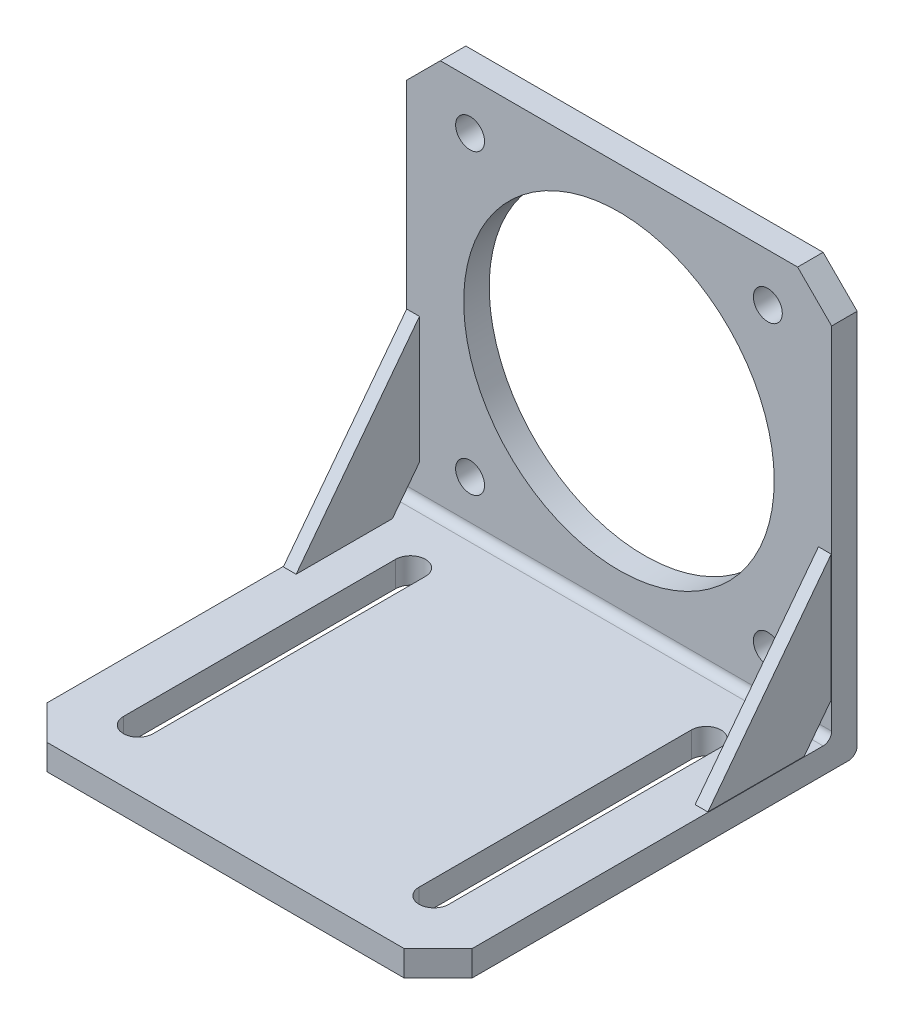
ISO-10303-21;
HEADER;
FILE_DESCRIPTION(('STEP AP214'),'2;1');
FILE_NAME('part.step','',(''),(''),'','','');
FILE_SCHEMA(('AUTOMOTIVE_DESIGN { 1 0 10303 214 1 1 1 1 }'));
ENDSEC;
DATA;
#1=APPLICATION_CONTEXT('core data for automotive mechanical design processes');
#2=APPLICATION_PROTOCOL_DEFINITION('international standard','automotive_design',2000,#1);
#3=PRODUCT_CONTEXT('',#1,'mechanical');
#4=PRODUCT('Part','Part','',(#3));
#5=PRODUCT_RELATED_PRODUCT_CATEGORY('part','',(#4));
#6=PRODUCT_DEFINITION_FORMATION('','',#4);
#7=PRODUCT_DEFINITION_CONTEXT('part definition',#1,'design');
#8=PRODUCT_DEFINITION('design','',#6,#7);
#9=PRODUCT_DEFINITION_SHAPE('','',#8);
#10=(LENGTH_UNIT() NAMED_UNIT(*) SI_UNIT(.MILLI.,.METRE.));
#11=(NAMED_UNIT(*) PLANE_ANGLE_UNIT() SI_UNIT($,.RADIAN.));
#12=(NAMED_UNIT(*) SI_UNIT($,.STERADIAN.) SOLID_ANGLE_UNIT());
#13=UNCERTAINTY_MEASURE_WITH_UNIT(LENGTH_MEASURE(1.E-05),#10,'distance_accuracy_value','');
#14=(GEOMETRIC_REPRESENTATION_CONTEXT(3) GLOBAL_UNCERTAINTY_ASSIGNED_CONTEXT((#13)) GLOBAL_UNIT_ASSIGNED_CONTEXT((#10,
#11,#12)) REPRESENTATION_CONTEXT('',''));
#15=CARTESIAN_POINT('',(0.,0.,0.));
#16=DIRECTION('',(0.,0.,1.));
#17=DIRECTION('',(1.,0.,0.));
#18=AXIS2_PLACEMENT_3D('',#15,#16,#17);
#19=CARTESIAN_POINT('',(0.,0.,6.));
#20=DIRECTION('',(0.,0.,-1.));
#21=DIRECTION('',(-1.,0.,0.));
#22=AXIS2_PLACEMENT_3D('',#19,#20,#21);
#23=PLANE('',#22);
#24=DIRECTION('',(0.,-1.,0.));
#25=VECTOR('',#24,1.);
#26=CARTESIAN_POINT('',(-46.9,8.28794911564137,6.));
#27=LINE('',#26,#25);
#28=CARTESIAN_POINT('',(-46.9,37.9579534258356,6.));
#29=VERTEX_POINT('',#28);
#30=CARTESIAN_POINT('',(-46.9,8.28794911564137,6.));
#31=VERTEX_POINT('',#30);
#32=EDGE_CURVE('E249',#29,#31,#27,.T.);
#33=ORIENTED_EDGE('',*,*,#32,.T.);
#34=DIRECTION('',(-1.,0.,0.));
#35=VECTOR('',#34,1.);
#36=CARTESIAN_POINT('',(-46.9,8.28794911564137,6.));
#37=LINE('',#36,#35);
#38=CARTESIAN_POINT('',(-49.9,8.28794911564137,6.));
#39=VERTEX_POINT('',#38);
#40=EDGE_CURVE('E262',#31,#39,#37,.T.);
#41=ORIENTED_EDGE('',*,*,#40,.T.);
#42=DIRECTION('',(0.,-1.,0.));
#43=VECTOR('',#42,1.);
#44=CARTESIAN_POINT('',(-49.9,8.28794911564137,6.));
#45=LINE('',#44,#43);
#46=CARTESIAN_POINT('',(-49.9,37.9579534258356,6.));
#47=VERTEX_POINT('',#46);
#48=EDGE_CURVE('E263',#47,#39,#45,.T.);
#49=ORIENTED_EDGE('',*,*,#48,.F.);
#50=DIRECTION('',(-1.,0.,0.));
#51=VECTOR('',#50,1.);
#52=CARTESIAN_POINT('',(-46.9,37.9579534258356,6.));
#53=LINE('',#52,#51);
#54=EDGE_CURVE('E271',#29,#47,#53,.T.);
#55=ORIENTED_EDGE('',*,*,#54,.F.);
#56=EDGE_LOOP('',(#33,#41,#49,#55));
#57=FACE_BOUND('',#56,.T.);
#58=CARTESIAN_POINT('',(-34.999999999998,11.2079534258356,6.));
#59=DIRECTION('',(0.,0.,1.));
#60=DIRECTION('',(1.,0.,0.));
#61=AXIS2_PLACEMENT_3D('',#58,#59,#60);
#62=CIRCLE('',#61,3.4);
#63=CARTESIAN_POINT('',(-31.599999999998,11.2079534258356,6.));
#64=VERTEX_POINT('',#63);
#65=EDGE_CURVE('E358',#64,#64,#62,.T.);
#66=ORIENTED_EDGE('',*,*,#65,.F.);
#67=EDGE_LOOP('',(#66));
#68=FACE_BOUND('',#67,.T.);
#69=CARTESIAN_POINT('',(35.0000000000019,11.2079534258376,6.));
#70=DIRECTION('',(0.,0.,1.));
#71=DIRECTION('',(1.,0.,0.));
#72=AXIS2_PLACEMENT_3D('',#69,#70,#71);
#73=CIRCLE('',#72,3.4);
#74=CARTESIAN_POINT('',(38.4000000000019,11.2079534258376,6.));
#75=VERTEX_POINT('',#74);
#76=EDGE_CURVE('E364',#75,#75,#73,.T.);
#77=ORIENTED_EDGE('',*,*,#76,.F.);
#78=EDGE_LOOP('',(#77));
#79=FACE_BOUND('',#78,.T.);
#80=CARTESIAN_POINT('',(35.,81.2079534258376,6.));
#81=DIRECTION('',(0.,0.,1.));
#82=DIRECTION('',(1.,0.,0.));
#83=AXIS2_PLACEMENT_3D('',#80,#81,#82);
#84=CIRCLE('',#83,3.4);
#85=CARTESIAN_POINT('',(38.4,81.2079534258376,6.));
#86=VERTEX_POINT('',#85);
#87=EDGE_CURVE('E370',#86,#86,#84,.T.);
#88=ORIENTED_EDGE('',*,*,#87,.F.);
#89=EDGE_LOOP('',(#88));
#90=FACE_BOUND('',#89,.T.);
#91=CARTESIAN_POINT('',(-35.,81.2079534258356,6.));
#92=DIRECTION('',(0.,0.,1.));
#93=DIRECTION('',(1.,0.,0.));
#94=AXIS2_PLACEMENT_3D('',#91,#92,#93);
#95=CIRCLE('',#94,3.4);
#96=CARTESIAN_POINT('',(-31.6,81.2079534258356,6.));
#97=VERTEX_POINT('',#96);
#98=EDGE_CURVE('E376',#97,#97,#95,.T.);
#99=ORIENTED_EDGE('',*,*,#98,.F.);
#100=EDGE_LOOP('',(#99));
#101=FACE_BOUND('',#100,.T.);
#102=CARTESIAN_POINT('',(0.,46.2079534258356,6.));
#103=DIRECTION('',(0.,0.,1.));
#104=DIRECTION('',(1.,0.,0.));
#105=AXIS2_PLACEMENT_3D('',#102,#103,#104);
#106=CIRCLE('',#105,36.5);
#107=CARTESIAN_POINT('',(36.5,46.2079534258356,6.));
#108=VERTEX_POINT('',#107);
#109=EDGE_CURVE('E382',#108,#108,#106,.T.);
#110=ORIENTED_EDGE('',*,*,#109,.F.);
#111=EDGE_LOOP('',(#110));
#112=FACE_BOUND('',#111,.T.);
#113=DIRECTION('',(0.,-1.,0.));
#114=VECTOR('',#113,1.);
#115=CARTESIAN_POINT('',(-50.,-6.04204657416441,6.));
#116=LINE('',#115,#114);
#117=CARTESIAN_POINT('',(-50.,84.4579534258356,6.));
#118=VERTEX_POINT('',#117);
#119=CARTESIAN_POINT('',(-50.,1.95795342583559,6.));
#120=VERTEX_POINT('',#119);
#121=EDGE_CURVE('E388',#118,#120,#116,.T.);
#122=ORIENTED_EDGE('',*,*,#121,.T.);
#123=DIRECTION('',(-1.,0.,0.));
#124=VECTOR('',#123,1.);
#125=CARTESIAN_POINT('',(50.,1.95795342583559,6.));
#126=LINE('',#125,#124);
#127=CARTESIAN_POINT('',(50.,1.95795342583559,6.));
#128=VERTEX_POINT('',#127);
#129=EDGE_CURVE('E457',#120,#128,#126,.F.);
#130=ORIENTED_EDGE('',*,*,#129,.T.);
#131=DIRECTION('',(0.,1.,0.));
#132=VECTOR('',#131,1.);
#133=CARTESIAN_POINT('',(50.,-6.04204657416441,6.));
#134=LINE('',#133,#132);
#135=CARTESIAN_POINT('',(50.,84.4579534258356,6.));
#136=VERTEX_POINT('',#135);
#137=EDGE_CURVE('E390',#128,#136,#134,.T.);
#138=ORIENTED_EDGE('',*,*,#137,.T.);
#139=DIRECTION('',(0.707106781186547,-0.707106781186548,0.));
#140=VECTOR('',#139,1.);
#141=CARTESIAN_POINT('',(42.,92.4579534258356,6.));
#142=LINE('',#141,#140);
#143=CARTESIAN_POINT('',(42.,92.4579534258356,6.));
#144=VERTEX_POINT('',#143);
#145=EDGE_CURVE('E425',#136,#144,#142,.F.);
#146=ORIENTED_EDGE('',*,*,#145,.T.);
#147=DIRECTION('',(-1.,0.,0.));
#148=VECTOR('',#147,1.);
#149=CARTESIAN_POINT('',(-50.,92.4579534258356,6.));
#150=LINE('',#149,#148);
#151=CARTESIAN_POINT('',(-41.9999999999999,92.4579534258356,6.));
#152=VERTEX_POINT('',#151);
#153=EDGE_CURVE('E393',#144,#152,#150,.T.);
#154=ORIENTED_EDGE('',*,*,#153,.T.);
#155=DIRECTION('',(0.707106781186549,0.707106781186546,0.));
#156=VECTOR('',#155,1.);
#157=CARTESIAN_POINT('',(-50.,84.4579534258356,6.));
#158=LINE('',#157,#156);
#159=EDGE_CURVE('E423',#152,#118,#158,.F.);
#160=ORIENTED_EDGE('',*,*,#159,.T.);
#161=EDGE_LOOP('',(#122,#130,#138,#146,#154,#160));
#162=FACE_BOUND('',#161,.T.);
#163=DIRECTION('',(0.,1.,0.));
#164=VECTOR('',#163,1.);
#165=CARTESIAN_POINT('',(46.9,8.2879491156414,6.));
#166=LINE('',#165,#164);
#167=CARTESIAN_POINT('',(46.9,8.2879491156414,6.));
#168=VERTEX_POINT('',#167);
#169=CARTESIAN_POINT('',(46.9,37.9579534258356,6.));
#170=VERTEX_POINT('',#169);
#171=EDGE_CURVE('E242',#168,#170,#166,.T.);
#172=ORIENTED_EDGE('',*,*,#171,.T.);
#173=DIRECTION('',(1.,0.,0.));
#174=VECTOR('',#173,1.);
#175=CARTESIAN_POINT('',(46.9,37.9579534258356,6.));
#176=LINE('',#175,#174);
#177=CARTESIAN_POINT('',(49.9,37.9579534258356,6.));
#178=VERTEX_POINT('',#177);
#179=EDGE_CURVE('E235',#170,#178,#176,.T.);
#180=ORIENTED_EDGE('',*,*,#179,.T.);
#181=DIRECTION('',(0.,1.,0.));
#182=VECTOR('',#181,1.);
#183=CARTESIAN_POINT('',(49.9,8.2879491156414,6.));
#184=LINE('',#183,#182);
#185=CARTESIAN_POINT('',(49.9,8.2879491156414,6.));
#186=VERTEX_POINT('',#185);
#187=EDGE_CURVE('E236',#186,#178,#184,.T.);
#188=ORIENTED_EDGE('',*,*,#187,.F.);
#189=DIRECTION('',(1.,0.,0.));
#190=VECTOR('',#189,1.);
#191=CARTESIAN_POINT('',(46.9,8.2879491156414,6.));
#192=LINE('',#191,#190);
#193=EDGE_CURVE('E244',#168,#186,#192,.T.);
#194=ORIENTED_EDGE('',*,*,#193,.F.);
#195=EDGE_LOOP('',(#172,#180,#188,#194));
#196=FACE_BOUND('',#195,.T.);
#197=ADVANCED_FACE('F33',(#57,#68,#79,#90,#101,#112,#162,#196),#23,.F.);
#198=CARTESIAN_POINT('',(-50.,-0.0420465741644057,98.5));
#199=DIRECTION('',(0.,-1.,0.));
#200=DIRECTION('',(0.,0.,-1.));
#201=AXIS2_PLACEMENT_3D('',#198,#199,#200);
#202=PLANE('',#201);
#203=DIRECTION('',(0.,0.,1.));
#204=VECTOR('',#203,1.);
#205=CARTESIAN_POINT('',(-46.9,-0.0420465741644057,35.));
#206=LINE('',#205,#204);
#207=CARTESIAN_POINT('',(-46.9,-0.0420465741644085,12.3571019737992));
#208=VERTEX_POINT('',#207);
#209=CARTESIAN_POINT('',(-46.9,-0.0420465741644057,35.));
#210=VERTEX_POINT('',#209);
#211=EDGE_CURVE('E256',#208,#210,#206,.T.);
#212=ORIENTED_EDGE('',*,*,#211,.T.);
#213=DIRECTION('',(-1.,0.,0.));
#214=VECTOR('',#213,1.);
#215=CARTESIAN_POINT('',(-46.9,-0.0420465741644057,35.));
#216=LINE('',#215,#214);
#217=CARTESIAN_POINT('',(-49.9,-0.0420465741644057,35.));
#218=VERTEX_POINT('',#217);
#219=EDGE_CURVE('E275',#210,#218,#216,.T.);
#220=ORIENTED_EDGE('',*,*,#219,.T.);
#221=DIRECTION('',(0.,0.,1.));
#222=VECTOR('',#221,1.);
#223=CARTESIAN_POINT('',(-49.9,-0.0420465741644057,35.));
#224=LINE('',#223,#222);
#225=CARTESIAN_POINT('',(-49.9,-0.0420465741644031,12.3571019737991));
#226=VERTEX_POINT('',#225);
#227=EDGE_CURVE('E268',#226,#218,#224,.T.);
#228=ORIENTED_EDGE('',*,*,#227,.F.);
#229=DIRECTION('',(-1.,0.,0.));
#230=VECTOR('',#229,1.);
#231=CARTESIAN_POINT('',(-46.9,-0.0420465741644085,12.3571019737992));
#232=LINE('',#231,#230);
#233=EDGE_CURVE('E278',#208,#226,#232,.T.);
#234=ORIENTED_EDGE('',*,*,#233,.F.);
#235=EDGE_LOOP('',(#212,#220,#228,#234));
#236=FACE_BOUND('',#235,.T.);
#237=DIRECTION('',(0.,0.,-1.));
#238=VECTOR('',#237,1.);
#239=CARTESIAN_POINT('',(38.25,-0.0420465741644057,84.25));
#240=LINE('',#239,#238);
#241=CARTESIAN_POINT('',(38.25,-0.0420465741644057,84.25));
#242=VERTEX_POINT('',#241);
#243=CARTESIAN_POINT('',(38.25,-0.0420465741644057,20.25));
#244=VERTEX_POINT('',#243);
#245=EDGE_CURVE('E298',#242,#244,#240,.T.);
#246=ORIENTED_EDGE('',*,*,#245,.F.);
#247=CARTESIAN_POINT('',(34.75,-0.0420465741644057,84.25));
#248=DIRECTION('',(0.,1.,0.));
#249=DIRECTION('',(0.,0.,-1.));
#250=AXIS2_PLACEMENT_3D('',#247,#248,#249);
#251=CIRCLE('',#250,3.50000000000004);
#252=CARTESIAN_POINT('',(31.2499999999999,-0.0420465741644057,84.25));
#253=VERTEX_POINT('',#252);
#254=EDGE_CURVE('E274',#253,#242,#251,.T.);
#255=ORIENTED_EDGE('',*,*,#254,.F.);
#256=DIRECTION('',(0.,0.,1.));
#257=VECTOR('',#256,1.);
#258=CARTESIAN_POINT('',(31.2499999999999,-0.0420465741644057,84.25));
#259=LINE('',#258,#257);
#260=CARTESIAN_POINT('',(31.2499999999999,-0.0420465741644057,20.25));
#261=VERTEX_POINT('',#260);
#262=EDGE_CURVE('E287',#261,#253,#259,.T.);
#263=ORIENTED_EDGE('',*,*,#262,.F.);
#264=CARTESIAN_POINT('',(34.75,-0.0420465741644057,20.2499999999999));
#265=DIRECTION('',(0.,1.,0.));
#266=DIRECTION('',(0.,0.,-1.));
#267=AXIS2_PLACEMENT_3D('',#264,#265,#266);
#268=CIRCLE('',#267,3.50000000000004);
#269=EDGE_CURVE('E301',#244,#261,#268,.T.);
#270=ORIENTED_EDGE('',*,*,#269,.F.);
#271=EDGE_LOOP('',(#246,#255,#263,#270));
#272=FACE_BOUND('',#271,.T.);
#273=DIRECTION('',(0.,0.,-1.));
#274=VECTOR('',#273,1.);
#275=CARTESIAN_POINT('',(-31.2499999999999,-0.0420465741644057,84.25));
#276=LINE('',#275,#274);
#277=CARTESIAN_POINT('',(-31.2499999999999,-0.0420465741644057,84.25));
#278=VERTEX_POINT('',#277);
#279=CARTESIAN_POINT('',(-31.25,-0.0420465741644057,20.25));
#280=VERTEX_POINT('',#279);
#281=EDGE_CURVE('E330',#278,#280,#276,.T.);
#282=ORIENTED_EDGE('',*,*,#281,.F.);
#283=CARTESIAN_POINT('',(-34.75,-0.0420465741644057,84.25));
#284=DIRECTION('',(0.,1.,0.));
#285=DIRECTION('',(0.,0.,1.));
#286=AXIS2_PLACEMENT_3D('',#283,#284,#285);
#287=CIRCLE('',#286,3.50000000000006);
#288=CARTESIAN_POINT('',(-38.25,-0.0420465741644057,84.25));
#289=VERTEX_POINT('',#288);
#290=EDGE_CURVE('E308',#289,#278,#287,.T.);
#291=ORIENTED_EDGE('',*,*,#290,.F.);
#292=DIRECTION('',(0.,0.,1.));
#293=VECTOR('',#292,1.);
#294=CARTESIAN_POINT('',(-38.25,-0.0420465741644057,84.25));
#295=LINE('',#294,#293);
#296=CARTESIAN_POINT('',(-38.25,-0.0420465741644057,20.25));
#297=VERTEX_POINT('',#296);
#298=EDGE_CURVE('E319',#297,#289,#295,.T.);
#299=ORIENTED_EDGE('',*,*,#298,.F.);
#300=CARTESIAN_POINT('',(-34.75,-0.0420465741644057,20.2499999999999));
#301=DIRECTION('',(0.,1.,0.));
#302=DIRECTION('',(0.,0.,1.));
#303=AXIS2_PLACEMENT_3D('',#300,#301,#302);
#304=CIRCLE('',#303,3.50000000000005);
#305=EDGE_CURVE('E333',#280,#297,#304,.T.);
#306=ORIENTED_EDGE('',*,*,#305,.F.);
#307=EDGE_LOOP('',(#282,#291,#299,#306));
#308=FACE_BOUND('',#307,.T.);
#309=DIRECTION('',(0.,0.,-1.));
#310=VECTOR('',#309,1.);
#311=CARTESIAN_POINT('',(50.,-0.0420465741644057,98.5));
#312=LINE('',#311,#310);
#313=CARTESIAN_POINT('',(50.,-0.0420465741644057,90.5));
#314=VERTEX_POINT('',#313);
#315=CARTESIAN_POINT('',(50.,-0.0420465741644057,8.00000000000001));
#316=VERTEX_POINT('',#315);
#317=EDGE_CURVE('E354',#314,#316,#312,.T.);
#318=ORIENTED_EDGE('',*,*,#317,.T.);
#319=DIRECTION('',(-1.,0.,0.));
#320=VECTOR('',#319,1.);
#321=CARTESIAN_POINT('',(-50.,-0.0420465741644057,8.00000000000001));
#322=LINE('',#321,#320);
#323=CARTESIAN_POINT('',(-50.,-0.0420465741644057,8.00000000000001));
#324=VERTEX_POINT('',#323);
#325=EDGE_CURVE('E455',#316,#324,#322,.T.);
#326=ORIENTED_EDGE('',*,*,#325,.T.);
#327=DIRECTION('',(0.,0.,-1.));
#328=VECTOR('',#327,1.);
#329=CARTESIAN_POINT('',(-50.,-0.0420465741644057,98.5));
#330=LINE('',#329,#328);
#331=CARTESIAN_POINT('',(-50.,-0.0420465741644057,90.5));
#332=VERTEX_POINT('',#331);
#333=EDGE_CURVE('E352',#332,#324,#330,.T.);
#334=ORIENTED_EDGE('',*,*,#333,.F.);
#335=DIRECTION('',(-0.707106781186547,0.,-0.707106781186548));
#336=VECTOR('',#335,1.);
#337=CARTESIAN_POINT('',(-42.,-0.0420465741644057,98.5));
#338=LINE('',#337,#336);
#339=CARTESIAN_POINT('',(-42.,-0.0420465741644057,98.5));
#340=VERTEX_POINT('',#339);
#341=EDGE_CURVE('E438',#332,#340,#338,.F.);
#342=ORIENTED_EDGE('',*,*,#341,.T.);
#343=DIRECTION('',(-1.,0.,0.));
#344=VECTOR('',#343,1.);
#345=CARTESIAN_POINT('',(-50.,-0.0420465741644057,98.5));
#346=LINE('',#345,#344);
#347=CARTESIAN_POINT('',(42.,-0.0420465741644057,98.5));
#348=VERTEX_POINT('',#347);
#349=EDGE_CURVE('E349',#348,#340,#346,.T.);
#350=ORIENTED_EDGE('',*,*,#349,.F.);
#351=DIRECTION('',(-0.707106781186547,0.,0.707106781186548));
#352=VECTOR('',#351,1.);
#353=CARTESIAN_POINT('',(42.,-0.0420465741644057,98.5));
#354=LINE('',#353,#352);
#355=EDGE_CURVE('E440',#348,#314,#354,.F.);
#356=ORIENTED_EDGE('',*,*,#355,.T.);
#357=EDGE_LOOP('',(#318,#326,#334,#342,#350,#356));
#358=FACE_BOUND('',#357,.T.);
#359=DIRECTION('',(0.,0.,-1.));
#360=VECTOR('',#359,1.);
#361=CARTESIAN_POINT('',(46.9,-0.0420465741643705,35.));
#362=LINE('',#361,#360);
#363=CARTESIAN_POINT('',(46.9,-0.0420465741643705,35.));
#364=VERTEX_POINT('',#363);
#365=CARTESIAN_POINT('',(46.9,-0.0420465741643733,12.3571019737992));
#366=VERTEX_POINT('',#365);
#367=EDGE_CURVE('E218',#364,#366,#362,.T.);
#368=ORIENTED_EDGE('',*,*,#367,.T.);
#369=DIRECTION('',(1.,0.,0.));
#370=VECTOR('',#369,1.);
#371=CARTESIAN_POINT('',(46.9,-0.0420465741643733,12.3571019737992));
#372=LINE('',#371,#370);
#373=CARTESIAN_POINT('',(49.9,-0.0420465741643722,12.3571019737992));
#374=VERTEX_POINT('',#373);
#375=EDGE_CURVE('E241',#366,#374,#372,.T.);
#376=ORIENTED_EDGE('',*,*,#375,.T.);
#377=DIRECTION('',(0.,0.,-1.));
#378=VECTOR('',#377,1.);
#379=CARTESIAN_POINT('',(49.9,-0.0420465741643694,35.));
#380=LINE('',#379,#378);
#381=CARTESIAN_POINT('',(49.9,-0.0420465741644135,35.));
#382=VERTEX_POINT('',#381);
#383=EDGE_CURVE('E240',#382,#374,#380,.T.);
#384=ORIENTED_EDGE('',*,*,#383,.F.);
#385=DIRECTION('',(1.,0.,0.));
#386=VECTOR('',#385,1.);
#387=CARTESIAN_POINT('',(46.9,-0.0420465741643705,35.));
#388=LINE('',#387,#386);
#389=EDGE_CURVE('E232',#364,#382,#388,.T.);
#390=ORIENTED_EDGE('',*,*,#389,.F.);
#391=EDGE_LOOP('',(#368,#376,#384,#390));
#392=FACE_BOUND('',#391,.T.);
#393=ADVANCED_FACE('F238',(#236,#272,#308,#358,#392),#202,.F.);
#394=CARTESIAN_POINT('',(0.,0.,0.));
#395=DIRECTION('',(0.,0.,-1.));
#396=DIRECTION('',(-1.,0.,0.));
#397=AXIS2_PLACEMENT_3D('',#394,#395,#396);
#398=PLANE('',#397);
#399=CARTESIAN_POINT('',(35.0000000000019,11.2079534258376,0.));
#400=DIRECTION('',(0.,0.,1.));
#401=DIRECTION('',(1.,0.,0.));
#402=AXIS2_PLACEMENT_3D('',#399,#400,#401);
#403=CIRCLE('',#402,3.4);
#404=CARTESIAN_POINT('',(38.4000000000019,11.2079534258376,0.));
#405=VERTEX_POINT('',#404);
#406=EDGE_CURVE('E361',#405,#405,#403,.T.);
#407=ORIENTED_EDGE('',*,*,#406,.T.);
#408=EDGE_LOOP('',(#407));
#409=FACE_BOUND('',#408,.T.);
#410=CARTESIAN_POINT('',(-35.,81.2079534258356,0.));
#411=DIRECTION('',(0.,0.,1.));
#412=DIRECTION('',(1.,0.,0.));
#413=AXIS2_PLACEMENT_3D('',#410,#411,#412);
#414=CIRCLE('',#413,3.4);
#415=CARTESIAN_POINT('',(-31.6,81.2079534258356,0.));
#416=VERTEX_POINT('',#415);
#417=EDGE_CURVE('E373',#416,#416,#414,.T.);
#418=ORIENTED_EDGE('',*,*,#417,.T.);
#419=EDGE_LOOP('',(#418));
#420=FACE_BOUND('',#419,.T.);
#421=DIRECTION('',(0.,1.,0.));
#422=VECTOR('',#421,1.);
#423=CARTESIAN_POINT('',(50.,-6.04204657416441,0.));
#424=LINE('',#423,#422);
#425=CARTESIAN_POINT('',(50.,-4.04204657416441,0.));
#426=VERTEX_POINT('',#425);
#427=CARTESIAN_POINT('',(50.,84.4579534258356,0.));
#428=VERTEX_POINT('',#427);
#429=EDGE_CURVE('E399',#426,#428,#424,.T.);
#430=ORIENTED_EDGE('',*,*,#429,.F.);
#431=DIRECTION('',(1.,0.,0.));
#432=VECTOR('',#431,1.);
#433=CARTESIAN_POINT('',(-50.,-4.04204657416441,0.));
#434=LINE('',#433,#432);
#435=CARTESIAN_POINT('',(-50.,-4.04204657416441,0.));
#436=VERTEX_POINT('',#435);
#437=EDGE_CURVE('E451',#426,#436,#434,.F.);
#438=ORIENTED_EDGE('',*,*,#437,.T.);
#439=DIRECTION('',(0.,-1.,0.));
#440=VECTOR('',#439,1.);
#441=CARTESIAN_POINT('',(-50.,-6.04204657416441,0.));
#442=LINE('',#441,#440);
#443=CARTESIAN_POINT('',(-50.,84.4579534258356,0.));
#444=VERTEX_POINT('',#443);
#445=EDGE_CURVE('E385',#444,#436,#442,.T.);
#446=ORIENTED_EDGE('',*,*,#445,.F.);
#447=DIRECTION('',(-0.707106781186549,-0.707106781186546,0.));
#448=VECTOR('',#447,1.);
#449=CARTESIAN_POINT('',(-67.2289767129177,67.2289767129179,0.));
#450=LINE('',#449,#448);
#451=CARTESIAN_POINT('',(-41.9999999999999,92.4579534258356,0.));
#452=VERTEX_POINT('',#451);
#453=EDGE_CURVE('E413',#444,#452,#450,.F.);
#454=ORIENTED_EDGE('',*,*,#453,.T.);
#455=DIRECTION('',(-1.,0.,0.));
#456=VECTOR('',#455,1.);
#457=CARTESIAN_POINT('',(-50.,92.4579534258356,0.));
#458=LINE('',#457,#456);
#459=CARTESIAN_POINT('',(42.,92.4579534258356,0.));
#460=VERTEX_POINT('',#459);
#461=EDGE_CURVE('E391',#460,#452,#458,.T.);
#462=ORIENTED_EDGE('',*,*,#461,.F.);
#463=DIRECTION('',(-0.707106781186547,0.707106781186548,0.));
#464=VECTOR('',#463,1.);
#465=CARTESIAN_POINT('',(67.2289767129178,67.2289767129177,0.));
#466=LINE('',#465,#464);
#467=EDGE_CURVE('E415',#460,#428,#466,.F.);
#468=ORIENTED_EDGE('',*,*,#467,.T.);
#469=EDGE_LOOP('',(#430,#438,#446,#454,#462,#468));
#470=FACE_BOUND('',#469,.T.);
#471=CARTESIAN_POINT('',(0.,46.2079534258356,0.));
#472=DIRECTION('',(0.,0.,1.));
#473=DIRECTION('',(1.,0.,0.));
#474=AXIS2_PLACEMENT_3D('',#471,#472,#473);
#475=CIRCLE('',#474,36.5);
#476=CARTESIAN_POINT('',(36.5,46.2079534258356,0.));
#477=VERTEX_POINT('',#476);
#478=EDGE_CURVE('E379',#477,#477,#475,.T.);
#479=ORIENTED_EDGE('',*,*,#478,.T.);
#480=EDGE_LOOP('',(#479));
#481=FACE_BOUND('',#480,.T.);
#482=CARTESIAN_POINT('',(35.,81.2079534258376,0.));
#483=DIRECTION('',(0.,0.,1.));
#484=DIRECTION('',(1.,0.,0.));
#485=AXIS2_PLACEMENT_3D('',#482,#483,#484);
#486=CIRCLE('',#485,3.4);
#487=CARTESIAN_POINT('',(38.4,81.2079534258376,0.));
#488=VERTEX_POINT('',#487);
#489=EDGE_CURVE('E367',#488,#488,#486,.T.);
#490=ORIENTED_EDGE('',*,*,#489,.T.);
#491=EDGE_LOOP('',(#490));
#492=FACE_BOUND('',#491,.T.);
#493=CARTESIAN_POINT('',(-34.999999999998,11.2079534258356,0.));
#494=DIRECTION('',(0.,0.,1.));
#495=DIRECTION('',(1.,0.,0.));
#496=AXIS2_PLACEMENT_3D('',#493,#494,#495);
#497=CIRCLE('',#496,3.4);
#498=CARTESIAN_POINT('',(-31.599999999998,11.2079534258356,0.));
#499=VERTEX_POINT('',#498);
#500=EDGE_CURVE('E357',#499,#499,#497,.T.);
#501=ORIENTED_EDGE('',*,*,#500,.T.);
#502=EDGE_LOOP('',(#501));
#503=FACE_BOUND('',#502,.T.);
#504=ADVANCED_FACE('F495',(#409,#420,#470,#481,#492,#503),#398,.T.);
#505=CARTESIAN_POINT('',(-50.,-6.04204657416441,6.));
#506=DIRECTION('',(1.,0.,0.));
#507=DIRECTION('',(0.,0.,-1.));
#508=AXIS2_PLACEMENT_3D('',#505,#506,#507);
#509=PLANE('',#508);
#510=ORIENTED_EDGE('',*,*,#445,.T.);
#511=CARTESIAN_POINT('',(-50.,-4.04204657416441,2.));
#512=DIRECTION('',(1.,0.,0.));
#513=DIRECTION('',(0.,0.,-1.));
#514=AXIS2_PLACEMENT_3D('',#511,#512,#513);
#515=CIRCLE('',#514,2.);
#516=CARTESIAN_POINT('',(-50.,-6.04204657416441,2.));
#517=VERTEX_POINT('',#516);
#518=EDGE_CURVE('E453',#436,#517,#515,.F.);
#519=ORIENTED_EDGE('',*,*,#518,.T.);
#520=DIRECTION('',(0.,0.,-1.));
#521=VECTOR('',#520,1.);
#522=CARTESIAN_POINT('',(-50.,-6.04204657416441,6.));
#523=LINE('',#522,#521);
#524=CARTESIAN_POINT('',(-50.,-6.04204657416441,90.5));
#525=VERTEX_POINT('',#524);
#526=EDGE_CURVE('E405',#525,#517,#523,.T.);
#527=ORIENTED_EDGE('',*,*,#526,.F.);
#528=DIRECTION('',(0.,1.,0.));
#529=VECTOR('',#528,1.);
#530=CARTESIAN_POINT('',(-50.,-6.04204657416441,90.5));
#531=LINE('',#530,#529);
#532=EDGE_CURVE('E427',#525,#332,#531,.T.);
#533=ORIENTED_EDGE('',*,*,#532,.T.);
#534=ORIENTED_EDGE('',*,*,#333,.T.);
#535=CARTESIAN_POINT('',(-50.,1.95795342583559,8.00000000000001));
#536=DIRECTION('',(1.,0.,0.));
#537=DIRECTION('',(0.,0.,-1.));
#538=AXIS2_PLACEMENT_3D('',#535,#536,#537);
#539=CIRCLE('',#538,2.);
#540=EDGE_CURVE('E41',#324,#120,#539,.T.);
#541=ORIENTED_EDGE('',*,*,#540,.T.);
#542=ORIENTED_EDGE('',*,*,#121,.F.);
#543=DIRECTION('',(0.,0.,-1.));
#544=VECTOR('',#543,1.);
#545=CARTESIAN_POINT('',(-50.,84.4579534258356,6.));
#546=LINE('',#545,#544);
#547=EDGE_CURVE('E429',#118,#444,#546,.T.);
#548=ORIENTED_EDGE('',*,*,#547,.T.);
#549=EDGE_LOOP('',(#510,#519,#527,#533,#534,#541,#542,#548));
#550=FACE_BOUND('',#549,.T.);
#551=ADVANCED_FACE('F470',(#550),#509,.F.);
#552=CARTESIAN_POINT('',(-50.,-6.04204657416441,6.));
#553=DIRECTION('',(0.,1.,0.));
#554=DIRECTION('',(0.,0.,1.));
#555=AXIS2_PLACEMENT_3D('',#552,#553,#554);
#556=PLANE('',#555);
#557=DIRECTION('',(0.,0.,1.));
#558=VECTOR('',#557,1.);
#559=CARTESIAN_POINT('',(31.2499999999999,-6.04204657416441,84.25));
#560=LINE('',#559,#558);
#561=CARTESIAN_POINT('',(31.2499999999999,-6.04204657416441,20.25));
#562=VERTEX_POINT('',#561);
#563=CARTESIAN_POINT('',(31.2499999999999,-6.04204657416441,84.25));
#564=VERTEX_POINT('',#563);
#565=EDGE_CURVE('E293',#562,#564,#560,.T.);
#566=ORIENTED_EDGE('',*,*,#565,.T.);
#567=CARTESIAN_POINT('',(34.75,-6.04204657416441,84.25));
#568=DIRECTION('',(0.,1.,0.));
#569=DIRECTION('',(0.,0.,-1.));
#570=AXIS2_PLACEMENT_3D('',#567,#568,#569);
#571=CIRCLE('',#570,3.50000000000004);
#572=CARTESIAN_POINT('',(38.25,-6.04204657416441,84.25));
#573=VERTEX_POINT('',#572);
#574=EDGE_CURVE('E283',#564,#573,#571,.T.);
#575=ORIENTED_EDGE('',*,*,#574,.T.);
#576=DIRECTION('',(0.,0.,-1.));
#577=VECTOR('',#576,1.);
#578=CARTESIAN_POINT('',(38.25,-6.04204657416441,84.25));
#579=LINE('',#578,#577);
#580=CARTESIAN_POINT('',(38.25,-6.04204657416441,20.25));
#581=VERTEX_POINT('',#580);
#582=EDGE_CURVE('E286',#573,#581,#579,.T.);
#583=ORIENTED_EDGE('',*,*,#582,.T.);
#584=CARTESIAN_POINT('',(34.75,-6.04204657416441,20.2499999999999));
#585=DIRECTION('',(0.,1.,0.));
#586=DIRECTION('',(0.,0.,-1.));
#587=AXIS2_PLACEMENT_3D('',#584,#585,#586);
#588=CIRCLE('',#587,3.50000000000004);
#589=EDGE_CURVE('E290',#581,#562,#588,.T.);
#590=ORIENTED_EDGE('',*,*,#589,.T.);
#591=EDGE_LOOP('',(#566,#575,#583,#590));
#592=FACE_BOUND('',#591,.T.);
#593=DIRECTION('',(0.,0.,1.));
#594=VECTOR('',#593,1.);
#595=CARTESIAN_POINT('',(-38.25,-6.04204657416441,84.25));
#596=LINE('',#595,#594);
#597=CARTESIAN_POINT('',(-38.25,-6.04204657416441,20.25));
#598=VERTEX_POINT('',#597);
#599=CARTESIAN_POINT('',(-38.25,-6.04204657416441,84.25));
#600=VERTEX_POINT('',#599);
#601=EDGE_CURVE('E325',#598,#600,#596,.T.);
#602=ORIENTED_EDGE('',*,*,#601,.T.);
#603=CARTESIAN_POINT('',(-34.75,-6.04204657416441,84.25));
#604=DIRECTION('',(0.,1.,0.));
#605=DIRECTION('',(0.,0.,1.));
#606=AXIS2_PLACEMENT_3D('',#603,#604,#605);
#607=CIRCLE('',#606,3.50000000000006);
#608=CARTESIAN_POINT('',(-31.2499999999999,-6.04204657416441,84.25));
#609=VERTEX_POINT('',#608);
#610=EDGE_CURVE('E315',#600,#609,#607,.T.);
#611=ORIENTED_EDGE('',*,*,#610,.T.);
#612=DIRECTION('',(0.,0.,-1.));
#613=VECTOR('',#612,1.);
#614=CARTESIAN_POINT('',(-31.2499999999999,-6.04204657416441,84.25));
#615=LINE('',#614,#613);
#616=CARTESIAN_POINT('',(-31.2499999999999,-6.04204657416441,20.25));
#617=VERTEX_POINT('',#616);
#618=EDGE_CURVE('E318',#609,#617,#615,.T.);
#619=ORIENTED_EDGE('',*,*,#618,.T.);
#620=CARTESIAN_POINT('',(-34.75,-6.04204657416441,20.2499999999999));
#621=DIRECTION('',(0.,1.,0.));
#622=DIRECTION('',(0.,0.,1.));
#623=AXIS2_PLACEMENT_3D('',#620,#621,#622);
#624=CIRCLE('',#623,3.50000000000005);
#625=EDGE_CURVE('E322',#617,#598,#624,.T.);
#626=ORIENTED_EDGE('',*,*,#625,.T.);
#627=EDGE_LOOP('',(#602,#611,#619,#626));
#628=FACE_BOUND('',#627,.T.);
#629=ORIENTED_EDGE('',*,*,#526,.T.);
#630=DIRECTION('',(1.,0.,0.));
#631=VECTOR('',#630,1.);
#632=CARTESIAN_POINT('',(50.,-6.04204657416441,2.));
#633=LINE('',#632,#631);
#634=CARTESIAN_POINT('',(50.,-6.04204657416441,2.));
#635=VERTEX_POINT('',#634);
#636=EDGE_CURVE('E446',#517,#635,#633,.T.);
#637=ORIENTED_EDGE('',*,*,#636,.T.);
#638=DIRECTION('',(0.,0.,-1.));
#639=VECTOR('',#638,1.);
#640=CARTESIAN_POINT('',(50.,-6.04204657416441,6.));
#641=LINE('',#640,#639);
#642=CARTESIAN_POINT('',(50.,-6.04204657416441,90.5));
#643=VERTEX_POINT('',#642);
#644=EDGE_CURVE('E396',#643,#635,#641,.T.);
#645=ORIENTED_EDGE('',*,*,#644,.F.);
#646=DIRECTION('',(0.707106781186547,0.,-0.707106781186548));
#647=VECTOR('',#646,1.);
#648=CARTESIAN_POINT('',(42.,-6.04204657416441,98.5));
#649=LINE('',#648,#647);
#650=CARTESIAN_POINT('',(42.,-6.04204657416441,98.5));
#651=VERTEX_POINT('',#650);
#652=EDGE_CURVE('E444',#643,#651,#649,.F.);
#653=ORIENTED_EDGE('',*,*,#652,.T.);
#654=DIRECTION('',(1.,0.,0.));
#655=VECTOR('',#654,1.);
#656=CARTESIAN_POINT('',(-50.,-6.04204657416441,98.5));
#657=LINE('',#656,#655);
#658=CARTESIAN_POINT('',(-42.,-6.04204657416441,98.5));
#659=VERTEX_POINT('',#658);
#660=EDGE_CURVE('E340',#659,#651,#657,.T.);
#661=ORIENTED_EDGE('',*,*,#660,.F.);
#662=DIRECTION('',(0.707106781186547,0.,0.707106781186548));
#663=VECTOR('',#662,1.);
#664=CARTESIAN_POINT('',(-42.,-6.04204657416441,98.5));
#665=LINE('',#664,#663);
#666=EDGE_CURVE('E442',#659,#525,#665,.F.);
#667=ORIENTED_EDGE('',*,*,#666,.T.);
#668=EDGE_LOOP('',(#629,#637,#645,#653,#661,#667));
#669=FACE_BOUND('',#668,.T.);
#670=ADVANCED_FACE('F487',(#592,#628,#669),#556,.F.);
#671=CARTESIAN_POINT('',(50.,-6.04204657416441,6.));
#672=DIRECTION('',(-1.,0.,0.));
#673=DIRECTION('',(0.,-1.,0.));
#674=AXIS2_PLACEMENT_3D('',#671,#672,#673);
#675=PLANE('',#674);
#676=ORIENTED_EDGE('',*,*,#644,.T.);
#677=CARTESIAN_POINT('',(50.,-4.04204657416441,2.));
#678=DIRECTION('',(-1.,0.,0.));
#679=DIRECTION('',(0.,-1.,0.));
#680=AXIS2_PLACEMENT_3D('',#677,#678,#679);
#681=CIRCLE('',#680,2.);
#682=EDGE_CURVE('E449',#635,#426,#681,.F.);
#683=ORIENTED_EDGE('',*,*,#682,.T.);
#684=ORIENTED_EDGE('',*,*,#429,.T.);
#685=DIRECTION('',(0.,0.,1.));
#686=VECTOR('',#685,1.);
#687=CARTESIAN_POINT('',(50.,84.4579534258356,6.));
#688=LINE('',#687,#686);
#689=EDGE_CURVE('E420',#428,#136,#688,.T.);
#690=ORIENTED_EDGE('',*,*,#689,.T.);
#691=ORIENTED_EDGE('',*,*,#137,.F.);
#692=CARTESIAN_POINT('',(50.,1.95795342583559,8.00000000000001));
#693=DIRECTION('',(-1.,0.,0.));
#694=DIRECTION('',(0.,-1.,0.));
#695=AXIS2_PLACEMENT_3D('',#692,#693,#694);
#696=CIRCLE('',#695,2.);
#697=EDGE_CURVE('E11',#128,#316,#696,.T.);
#698=ORIENTED_EDGE('',*,*,#697,.T.);
#699=ORIENTED_EDGE('',*,*,#317,.F.);
#700=DIRECTION('',(0.,-1.,0.));
#701=VECTOR('',#700,1.);
#702=CARTESIAN_POINT('',(50.,-6.04204657416441,90.5));
#703=LINE('',#702,#701);
#704=EDGE_CURVE('E418',#314,#643,#703,.T.);
#705=ORIENTED_EDGE('',*,*,#704,.T.);
#706=EDGE_LOOP('',(#676,#683,#684,#690,#691,#698,#699,#705));
#707=FACE_BOUND('',#706,.T.);
#708=ADVANCED_FACE('F463',(#707),#675,.F.);
#709=CARTESIAN_POINT('',(-50.,92.4579534258356,6.));
#710=DIRECTION('',(0.,-1.,0.));
#711=DIRECTION('',(0.,0.,-1.));
#712=AXIS2_PLACEMENT_3D('',#709,#710,#711);
#713=PLANE('',#712);
#714=ORIENTED_EDGE('',*,*,#153,.F.);
#715=DIRECTION('',(0.,0.,-1.));
#716=VECTOR('',#715,1.);
#717=CARTESIAN_POINT('',(42.,92.4579534258356,6.));
#718=LINE('',#717,#716);
#719=EDGE_CURVE('E410',#144,#460,#718,.T.);
#720=ORIENTED_EDGE('',*,*,#719,.T.);
#721=ORIENTED_EDGE('',*,*,#461,.T.);
#722=DIRECTION('',(0.,0.,1.));
#723=VECTOR('',#722,1.);
#724=CARTESIAN_POINT('',(-41.9999999999999,92.4579534258356,6.));
#725=LINE('',#724,#723);
#726=EDGE_CURVE('E408',#452,#152,#725,.T.);
#727=ORIENTED_EDGE('',*,*,#726,.T.);
#728=EDGE_LOOP('',(#714,#720,#721,#727));
#729=FACE_BOUND('',#728,.T.);
#730=ADVANCED_FACE('F505',(#729),#713,.F.);
#731=CARTESIAN_POINT('',(0.,46.2079534258356,6.));
#732=DIRECTION('',(0.,0.,-1.));
#733=DIRECTION('',(-1.,0.,0.));
#734=AXIS2_PLACEMENT_3D('',#731,#732,#733);
#735=CYLINDRICAL_SURFACE('',#734,36.5);
#736=ORIENTED_EDGE('',*,*,#109,.T.);
#737=EDGE_LOOP('',(#736));
#738=FACE_BOUND('',#737,.T.);
#739=ORIENTED_EDGE('',*,*,#478,.F.);
#740=EDGE_LOOP('',(#739));
#741=FACE_BOUND('',#740,.T.);
#742=ADVANCED_FACE('F529',(#738,#741),#735,.F.);
#743=CARTESIAN_POINT('',(-35.,81.2079534258356,6.));
#744=DIRECTION('',(0.,0.,-1.));
#745=DIRECTION('',(-1.,0.,0.));
#746=AXIS2_PLACEMENT_3D('',#743,#744,#745);
#747=CYLINDRICAL_SURFACE('',#746,3.4);
#748=ORIENTED_EDGE('',*,*,#98,.T.);
#749=EDGE_LOOP('',(#748));
#750=FACE_BOUND('',#749,.T.);
#751=ORIENTED_EDGE('',*,*,#417,.F.);
#752=EDGE_LOOP('',(#751));
#753=FACE_BOUND('',#752,.T.);
#754=ADVANCED_FACE('F567',(#750,#753),#747,.F.);
#755=CARTESIAN_POINT('',(35.,81.2079534258376,6.));
#756=DIRECTION('',(0.,0.,-1.));
#757=DIRECTION('',(-1.,0.,0.));
#758=AXIS2_PLACEMENT_3D('',#755,#756,#757);
#759=CYLINDRICAL_SURFACE('',#758,3.4);
#760=ORIENTED_EDGE('',*,*,#87,.T.);
#761=EDGE_LOOP('',(#760));
#762=FACE_BOUND('',#761,.T.);
#763=ORIENTED_EDGE('',*,*,#489,.F.);
#764=EDGE_LOOP('',(#763));
#765=FACE_BOUND('',#764,.T.);
#766=ADVANCED_FACE('F574',(#762,#765),#759,.F.);
#767=CARTESIAN_POINT('',(35.0000000000019,11.2079534258376,6.));
#768=DIRECTION('',(0.,0.,-1.));
#769=DIRECTION('',(-1.,0.,0.));
#770=AXIS2_PLACEMENT_3D('',#767,#768,#769);
#771=CYLINDRICAL_SURFACE('',#770,3.4);
#772=ORIENTED_EDGE('',*,*,#76,.T.);
#773=EDGE_LOOP('',(#772));
#774=FACE_BOUND('',#773,.T.);
#775=ORIENTED_EDGE('',*,*,#406,.F.);
#776=EDGE_LOOP('',(#775));
#777=FACE_BOUND('',#776,.T.);
#778=ADVANCED_FACE('F581',(#774,#777),#771,.F.);
#779=CARTESIAN_POINT('',(-34.999999999998,11.2079534258356,6.));
#780=DIRECTION('',(0.,0.,-1.));
#781=DIRECTION('',(-1.,0.,0.));
#782=AXIS2_PLACEMENT_3D('',#779,#780,#781);
#783=CYLINDRICAL_SURFACE('',#782,3.4);
#784=ORIENTED_EDGE('',*,*,#65,.T.);
#785=EDGE_LOOP('',(#784));
#786=FACE_BOUND('',#785,.T.);
#787=ORIENTED_EDGE('',*,*,#500,.F.);
#788=EDGE_LOOP('',(#787));
#789=FACE_BOUND('',#788,.T.);
#790=ADVANCED_FACE('F589',(#786,#789),#783,.F.);
#791=CARTESIAN_POINT('',(0.,0.,98.5));
#792=DIRECTION('',(0.,0.,-1.));
#793=DIRECTION('',(-1.,0.,0.));
#794=AXIS2_PLACEMENT_3D('',#791,#792,#793);
#795=PLANE('',#794);
#796=ORIENTED_EDGE('',*,*,#660,.T.);
#797=DIRECTION('',(0.,1.,0.));
#798=VECTOR('',#797,1.);
#799=CARTESIAN_POINT('',(42.,0.,98.5));
#800=LINE('',#799,#798);
#801=EDGE_CURVE('E435',#651,#348,#800,.T.);
#802=ORIENTED_EDGE('',*,*,#801,.T.);
#803=ORIENTED_EDGE('',*,*,#349,.T.);
#804=DIRECTION('',(0.,-1.,0.));
#805=VECTOR('',#804,1.);
#806=CARTESIAN_POINT('',(-42.,0.,98.5));
#807=LINE('',#806,#805);
#808=EDGE_CURVE('E432',#340,#659,#807,.T.);
#809=ORIENTED_EDGE('',*,*,#808,.T.);
#810=EDGE_LOOP('',(#796,#802,#803,#809));
#811=FACE_BOUND('',#810,.T.);
#812=ADVANCED_FACE('F478',(#811),#795,.F.);
#813=CARTESIAN_POINT('',(42.,92.4579534258356,6.));
#814=DIRECTION('',(-0.707106781186548,-0.707106781186547,0.));
#815=DIRECTION('',(0.,0.,-1.));
#816=AXIS2_PLACEMENT_3D('',#813,#814,#815);
#817=PLANE('',#816);
#818=ORIENTED_EDGE('',*,*,#145,.F.);
#819=ORIENTED_EDGE('',*,*,#689,.F.);
#820=ORIENTED_EDGE('',*,*,#467,.F.);
#821=ORIENTED_EDGE('',*,*,#719,.F.);
#822=EDGE_LOOP('',(#818,#819,#820,#821));
#823=FACE_BOUND('',#822,.T.);
#824=ADVANCED_FACE('F501',(#823),#817,.F.);
#825=CARTESIAN_POINT('',(-50.,84.4579534258356,6.));
#826=DIRECTION('',(0.707106781186546,-0.707106781186549,0.));
#827=DIRECTION('',(0.,0.,-1.));
#828=AXIS2_PLACEMENT_3D('',#825,#826,#827);
#829=PLANE('',#828);
#830=ORIENTED_EDGE('',*,*,#159,.F.);
#831=ORIENTED_EDGE('',*,*,#726,.F.);
#832=ORIENTED_EDGE('',*,*,#453,.F.);
#833=ORIENTED_EDGE('',*,*,#547,.F.);
#834=EDGE_LOOP('',(#830,#831,#832,#833));
#835=FACE_BOUND('',#834,.T.);
#836=ADVANCED_FACE('F508',(#835),#829,.F.);
#837=CARTESIAN_POINT('',(42.,0.,98.5));
#838=DIRECTION('',(-0.707106781186548,0.,-0.707106781186547));
#839=DIRECTION('',(0.,1.,0.));
#840=AXIS2_PLACEMENT_3D('',#837,#838,#839);
#841=PLANE('',#840);
#842=ORIENTED_EDGE('',*,*,#652,.F.);
#843=ORIENTED_EDGE('',*,*,#704,.F.);
#844=ORIENTED_EDGE('',*,*,#355,.F.);
#845=ORIENTED_EDGE('',*,*,#801,.F.);
#846=EDGE_LOOP('',(#842,#843,#844,#845));
#847=FACE_BOUND('',#846,.T.);
#848=ADVANCED_FACE('F483',(#847),#841,.F.);
#849=CARTESIAN_POINT('',(-42.,0.,98.5));
#850=DIRECTION('',(0.707106781186548,0.,-0.707106781186547));
#851=DIRECTION('',(0.,-1.,0.));
#852=AXIS2_PLACEMENT_3D('',#849,#850,#851);
#853=PLANE('',#852);
#854=ORIENTED_EDGE('',*,*,#341,.F.);
#855=ORIENTED_EDGE('',*,*,#532,.F.);
#856=ORIENTED_EDGE('',*,*,#666,.F.);
#857=ORIENTED_EDGE('',*,*,#808,.F.);
#858=EDGE_LOOP('',(#854,#855,#856,#857));
#859=FACE_BOUND('',#858,.T.);
#860=ADVANCED_FACE('F474',(#859),#853,.F.);
#861=CARTESIAN_POINT('',(-34.75,-6.04204657416441,84.25));
#862=DIRECTION('',(0.,1.,0.));
#863=DIRECTION('',(0.,0.,1.));
#864=AXIS2_PLACEMENT_3D('',#861,#862,#863);
#865=CYLINDRICAL_SURFACE('',#864,3.50000000000006);
#866=ORIENTED_EDGE('',*,*,#290,.T.);
#867=DIRECTION('',(0.,1.,0.));
#868=VECTOR('',#867,1.);
#869=CARTESIAN_POINT('',(-31.2499999999999,-6.04204657416441,84.25));
#870=LINE('',#869,#868);
#871=EDGE_CURVE('E328',#609,#278,#870,.T.);
#872=ORIENTED_EDGE('',*,*,#871,.F.);
#873=ORIENTED_EDGE('',*,*,#610,.F.);
#874=DIRECTION('',(0.,1.,0.));
#875=VECTOR('',#874,1.);
#876=CARTESIAN_POINT('',(-38.25,-6.04204657416441,84.25));
#877=LINE('',#876,#875);
#878=EDGE_CURVE('E338',#600,#289,#877,.T.);
#879=ORIENTED_EDGE('',*,*,#878,.T.);
#880=EDGE_LOOP('',(#866,#872,#873,#879));
#881=FACE_BOUND('',#880,.T.);
#882=ADVANCED_FACE('F625',(#881),#865,.F.);
#883=CARTESIAN_POINT('',(-38.25,-6.04204657416441,84.25));
#884=DIRECTION('',(-1.,0.,0.));
#885=DIRECTION('',(0.,0.,1.));
#886=AXIS2_PLACEMENT_3D('',#883,#884,#885);
#887=PLANE('',#886);
#888=ORIENTED_EDGE('',*,*,#298,.T.);
#889=ORIENTED_EDGE('',*,*,#878,.F.);
#890=ORIENTED_EDGE('',*,*,#601,.F.);
#891=DIRECTION('',(0.,1.,0.));
#892=VECTOR('',#891,1.);
#893=CARTESIAN_POINT('',(-38.25,-6.04204657416441,20.25));
#894=LINE('',#893,#892);
#895=EDGE_CURVE('E341',#598,#297,#894,.T.);
#896=ORIENTED_EDGE('',*,*,#895,.T.);
#897=EDGE_LOOP('',(#888,#889,#890,#896));
#898=FACE_BOUND('',#897,.T.);
#899=ADVANCED_FACE('F634',(#898),#887,.F.);
#900=CARTESIAN_POINT('',(-34.75,-6.04204657416441,20.2499999999999));
#901=DIRECTION('',(0.,1.,0.));
#902=DIRECTION('',(0.,0.,1.));
#903=AXIS2_PLACEMENT_3D('',#900,#901,#902);
#904=CYLINDRICAL_SURFACE('',#903,3.50000000000005);
#905=ORIENTED_EDGE('',*,*,#305,.T.);
#906=ORIENTED_EDGE('',*,*,#895,.F.);
#907=ORIENTED_EDGE('',*,*,#625,.F.);
#908=DIRECTION('',(0.,1.,0.));
#909=VECTOR('',#908,1.);
#910=CARTESIAN_POINT('',(-31.25,-6.04204657416441,20.25));
#911=LINE('',#910,#909);
#912=EDGE_CURVE('E343',#617,#280,#911,.T.);
#913=ORIENTED_EDGE('',*,*,#912,.T.);
#914=EDGE_LOOP('',(#905,#906,#907,#913));
#915=FACE_BOUND('',#914,.T.);
#916=ADVANCED_FACE('F644',(#915),#904,.F.);
#917=CARTESIAN_POINT('',(-31.2499999999999,-6.04204657416441,84.25));
#918=DIRECTION('',(1.,0.,0.));
#919=DIRECTION('',(0.,0.,-1.));
#920=AXIS2_PLACEMENT_3D('',#917,#918,#919);
#921=PLANE('',#920);
#922=ORIENTED_EDGE('',*,*,#281,.T.);
#923=ORIENTED_EDGE('',*,*,#912,.F.);
#924=ORIENTED_EDGE('',*,*,#618,.F.);
#925=ORIENTED_EDGE('',*,*,#871,.T.);
#926=EDGE_LOOP('',(#922,#923,#924,#925));
#927=FACE_BOUND('',#926,.T.);
#928=ADVANCED_FACE('F654',(#927),#921,.F.);
#929=CARTESIAN_POINT('',(34.75,-6.04204657416441,84.25));
#930=DIRECTION('',(0.,1.,0.));
#931=DIRECTION('',(0.,0.,1.));
#932=AXIS2_PLACEMENT_3D('',#929,#930,#931);
#933=CYLINDRICAL_SURFACE('',#932,3.50000000000004);
#934=ORIENTED_EDGE('',*,*,#254,.T.);
#935=DIRECTION('',(0.,1.,0.));
#936=VECTOR('',#935,1.);
#937=CARTESIAN_POINT('',(38.25,-6.04204657416441,84.25));
#938=LINE('',#937,#936);
#939=EDGE_CURVE('E296',#573,#242,#938,.T.);
#940=ORIENTED_EDGE('',*,*,#939,.F.);
#941=ORIENTED_EDGE('',*,*,#574,.F.);
#942=DIRECTION('',(0.,1.,0.));
#943=VECTOR('',#942,1.);
#944=CARTESIAN_POINT('',(31.2499999999999,-6.04204657416441,84.25));
#945=LINE('',#944,#943);
#946=EDGE_CURVE('E306',#564,#253,#945,.T.);
#947=ORIENTED_EDGE('',*,*,#946,.T.);
#948=EDGE_LOOP('',(#934,#940,#941,#947));
#949=FACE_BOUND('',#948,.T.);
#950=ADVANCED_FACE('F664',(#949),#933,.F.);
#951=CARTESIAN_POINT('',(31.2499999999999,-6.04204657416441,84.25));
#952=DIRECTION('',(-1.,0.,0.));
#953=DIRECTION('',(0.,0.,1.));
#954=AXIS2_PLACEMENT_3D('',#951,#952,#953);
#955=PLANE('',#954);
#956=ORIENTED_EDGE('',*,*,#262,.T.);
#957=ORIENTED_EDGE('',*,*,#946,.F.);
#958=ORIENTED_EDGE('',*,*,#565,.F.);
#959=DIRECTION('',(0.,1.,0.));
#960=VECTOR('',#959,1.);
#961=CARTESIAN_POINT('',(31.2499999999999,-6.04204657416441,20.25));
#962=LINE('',#961,#960);
#963=EDGE_CURVE('E309',#562,#261,#962,.T.);
#964=ORIENTED_EDGE('',*,*,#963,.T.);
#965=EDGE_LOOP('',(#956,#957,#958,#964));
#966=FACE_BOUND('',#965,.T.);
#967=ADVANCED_FACE('F674',(#966),#955,.F.);
#968=CARTESIAN_POINT('',(34.75,-6.04204657416441,20.2499999999999));
#969=DIRECTION('',(0.,1.,0.));
#970=DIRECTION('',(0.,0.,1.));
#971=AXIS2_PLACEMENT_3D('',#968,#969,#970);
#972=CYLINDRICAL_SURFACE('',#971,3.50000000000004);
#973=ORIENTED_EDGE('',*,*,#269,.T.);
#974=ORIENTED_EDGE('',*,*,#963,.F.);
#975=ORIENTED_EDGE('',*,*,#589,.F.);
#976=DIRECTION('',(0.,1.,0.));
#977=VECTOR('',#976,1.);
#978=CARTESIAN_POINT('',(38.25,-6.04204657416441,20.25));
#979=LINE('',#978,#977);
#980=EDGE_CURVE('E311',#581,#244,#979,.T.);
#981=ORIENTED_EDGE('',*,*,#980,.T.);
#982=EDGE_LOOP('',(#973,#974,#975,#981));
#983=FACE_BOUND('',#982,.T.);
#984=ADVANCED_FACE('F684',(#983),#972,.F.);
#985=CARTESIAN_POINT('',(38.25,-6.04204657416441,84.25));
#986=DIRECTION('',(1.,0.,0.));
#987=DIRECTION('',(0.,0.,-1.));
#988=AXIS2_PLACEMENT_3D('',#985,#986,#987);
#989=PLANE('',#988);
#990=ORIENTED_EDGE('',*,*,#245,.T.);
#991=ORIENTED_EDGE('',*,*,#980,.F.);
#992=ORIENTED_EDGE('',*,*,#582,.F.);
#993=ORIENTED_EDGE('',*,*,#939,.T.);
#994=EDGE_LOOP('',(#990,#991,#992,#993));
#995=FACE_BOUND('',#994,.T.);
#996=ADVANCED_FACE('F694',(#995),#989,.F.);
#997=CARTESIAN_POINT('',(-46.9,37.9579534258356,6.));
#998=DIRECTION('',(0.,0.606673319350191,0.794951246045077));
#999=DIRECTION('',(0.,-0.794951246045077,0.606673319350191));
#1000=AXIS2_PLACEMENT_3D('',#997,#998,#999);
#1001=PLANE('',#1000);
#1002=DIRECTION('',(0.,0.794951246045077,-0.606673319350191));
#1003=VECTOR('',#1002,1.);
#1004=CARTESIAN_POINT('',(-49.9,37.9579534258356,6.));
#1005=LINE('',#1004,#1003);
#1006=EDGE_CURVE('E253',#218,#47,#1005,.T.);
#1007=ORIENTED_EDGE('',*,*,#1006,.F.);
#1008=ORIENTED_EDGE('',*,*,#219,.F.);
#1009=DIRECTION('',(0.,0.794951246045077,-0.606673319350191));
#1010=VECTOR('',#1009,1.);
#1011=CARTESIAN_POINT('',(-46.9,37.9579534258356,6.));
#1012=LINE('',#1011,#1010);
#1013=EDGE_CURVE('E259',#210,#29,#1012,.T.);
#1014=ORIENTED_EDGE('',*,*,#1013,.T.);
#1015=ORIENTED_EDGE('',*,*,#54,.T.);
#1016=EDGE_LOOP('',(#1007,#1008,#1014,#1015));
#1017=FACE_BOUND('',#1016,.T.);
#1018=ADVANCED_FACE('F704',(#1017),#1001,.T.);
#1019=CARTESIAN_POINT('',(-46.9,8.28794911564137,6.));
#1020=DIRECTION('',(0.,-0.606673319350191,-0.794951246045077));
#1021=DIRECTION('',(0.,0.794951246045077,-0.606673319350191));
#1022=AXIS2_PLACEMENT_3D('',#1019,#1020,#1021);
#1023=PLANE('',#1022);
#1024=DIRECTION('',(0.,-0.794951246045077,0.606673319350191));
#1025=VECTOR('',#1024,1.);
#1026=CARTESIAN_POINT('',(-49.9,8.28794911564137,6.));
#1027=LINE('',#1026,#1025);
#1028=EDGE_CURVE('E266',#39,#226,#1027,.T.);
#1029=ORIENTED_EDGE('',*,*,#1028,.F.);
#1030=ORIENTED_EDGE('',*,*,#40,.F.);
#1031=DIRECTION('',(0.,-0.794951246045077,0.606673319350191));
#1032=VECTOR('',#1031,1.);
#1033=CARTESIAN_POINT('',(-46.9,8.28794911564137,6.));
#1034=LINE('',#1033,#1032);
#1035=EDGE_CURVE('E252',#31,#208,#1034,.T.);
#1036=ORIENTED_EDGE('',*,*,#1035,.T.);
#1037=ORIENTED_EDGE('',*,*,#233,.T.);
#1038=EDGE_LOOP('',(#1029,#1030,#1036,#1037));
#1039=FACE_BOUND('',#1038,.T.);
#1040=ADVANCED_FACE('F714',(#1039),#1023,.T.);
#1041=CARTESIAN_POINT('',(-46.9,0.,0.));
#1042=DIRECTION('',(-1.,0.,0.));
#1043=DIRECTION('',(0.,0.,1.));
#1044=AXIS2_PLACEMENT_3D('',#1041,#1042,#1043);
#1045=PLANE('',#1044);
#1046=ORIENTED_EDGE('',*,*,#32,.F.);
#1047=ORIENTED_EDGE('',*,*,#1013,.F.);
#1048=ORIENTED_EDGE('',*,*,#211,.F.);
#1049=ORIENTED_EDGE('',*,*,#1035,.F.);
#1050=EDGE_LOOP('',(#1046,#1047,#1048,#1049));
#1051=FACE_BOUND('',#1050,.T.);
#1052=ADVANCED_FACE('F724',(#1051),#1045,.F.);
#1053=CARTESIAN_POINT('',(-49.9,0.,0.));
#1054=DIRECTION('',(-1.,0.,0.));
#1055=DIRECTION('',(0.,0.,1.));
#1056=AXIS2_PLACEMENT_3D('',#1053,#1054,#1055);
#1057=PLANE('',#1056);
#1058=ORIENTED_EDGE('',*,*,#48,.T.);
#1059=ORIENTED_EDGE('',*,*,#1028,.T.);
#1060=ORIENTED_EDGE('',*,*,#227,.T.);
#1061=ORIENTED_EDGE('',*,*,#1006,.T.);
#1062=EDGE_LOOP('',(#1058,#1059,#1060,#1061));
#1063=FACE_BOUND('',#1062,.T.);
#1064=ADVANCED_FACE('F734',(#1063),#1057,.T.);
#1065=CARTESIAN_POINT('',(46.9,37.9579534258356,6.));
#1066=DIRECTION('',(0.,0.606673319350191,0.794951246045077));
#1067=DIRECTION('',(0.,-0.794951246045077,0.606673319350191));
#1068=AXIS2_PLACEMENT_3D('',#1065,#1066,#1067);
#1069=PLANE('',#1068);
#1070=DIRECTION('',(0.,-0.794951246045077,0.606673319350191));
#1071=VECTOR('',#1070,1.);
#1072=CARTESIAN_POINT('',(49.9,37.9579534258356,6.));
#1073=LINE('',#1072,#1071);
#1074=EDGE_CURVE('E841',#178,#382,#1073,.T.);
#1075=ORIENTED_EDGE('',*,*,#1074,.F.);
#1076=ORIENTED_EDGE('',*,*,#179,.F.);
#1077=DIRECTION('',(0.,-0.794951246045077,0.606673319350191));
#1078=VECTOR('',#1077,1.);
#1079=CARTESIAN_POINT('',(46.9,37.9579534258356,6.));
#1080=LINE('',#1079,#1078);
#1081=EDGE_CURVE('E222',#170,#364,#1080,.T.);
#1082=ORIENTED_EDGE('',*,*,#1081,.T.);
#1083=ORIENTED_EDGE('',*,*,#389,.T.);
#1084=EDGE_LOOP('',(#1075,#1076,#1082,#1083));
#1085=FACE_BOUND('',#1084,.T.);
#1086=ADVANCED_FACE('F231',(#1085),#1069,.T.);
#1087=CARTESIAN_POINT('',(46.9,-0.0420465741643733,12.3571019737992));
#1088=DIRECTION('',(0.,-0.606673319350191,-0.794951246045077));
#1089=DIRECTION('',(0.,0.794951246045077,-0.606673319350191));
#1090=AXIS2_PLACEMENT_3D('',#1087,#1088,#1089);
#1091=PLANE('',#1090);
#1092=DIRECTION('',(0.,0.794951246045077,-0.606673319350191));
#1093=VECTOR('',#1092,1.);
#1094=CARTESIAN_POINT('',(49.9,-0.0420465741643722,12.3571019737992));
#1095=LINE('',#1094,#1093);
#1096=EDGE_CURVE('E844',#374,#186,#1095,.T.);
#1097=ORIENTED_EDGE('',*,*,#1096,.F.);
#1098=ORIENTED_EDGE('',*,*,#375,.F.);
#1099=DIRECTION('',(0.,0.794951246045077,-0.606673319350191));
#1100=VECTOR('',#1099,1.);
#1101=CARTESIAN_POINT('',(46.9,-0.0420465741643733,12.3571019737992));
#1102=LINE('',#1101,#1100);
#1103=EDGE_CURVE('E224',#366,#168,#1102,.T.);
#1104=ORIENTED_EDGE('',*,*,#1103,.T.);
#1105=ORIENTED_EDGE('',*,*,#193,.T.);
#1106=EDGE_LOOP('',(#1097,#1098,#1104,#1105));
#1107=FACE_BOUND('',#1106,.T.);
#1108=ADVANCED_FACE('F754',(#1107),#1091,.T.);
#1109=CARTESIAN_POINT('',(46.9,0.,0.));
#1110=DIRECTION('',(1.,0.,0.));
#1111=DIRECTION('',(0.,1.,0.));
#1112=AXIS2_PLACEMENT_3D('',#1109,#1110,#1111);
#1113=PLANE('',#1112);
#1114=ORIENTED_EDGE('',*,*,#1081,.F.);
#1115=ORIENTED_EDGE('',*,*,#171,.F.);
#1116=ORIENTED_EDGE('',*,*,#1103,.F.);
#1117=ORIENTED_EDGE('',*,*,#367,.F.);
#1118=EDGE_LOOP('',(#1114,#1115,#1116,#1117));
#1119=FACE_BOUND('',#1118,.T.);
#1120=ADVANCED_FACE('F220',(#1119),#1113,.F.);
#1121=CARTESIAN_POINT('',(49.9,0.,0.));
#1122=DIRECTION('',(1.,0.,0.));
#1123=DIRECTION('',(0.,1.,0.));
#1124=AXIS2_PLACEMENT_3D('',#1121,#1122,#1123);
#1125=PLANE('',#1124);
#1126=ORIENTED_EDGE('',*,*,#1074,.T.);
#1127=ORIENTED_EDGE('',*,*,#383,.T.);
#1128=ORIENTED_EDGE('',*,*,#1096,.T.);
#1129=ORIENTED_EDGE('',*,*,#187,.T.);
#1130=EDGE_LOOP('',(#1126,#1127,#1128,#1129));
#1131=FACE_BOUND('',#1130,.T.);
#1132=ADVANCED_FACE('F773',(#1131),#1125,.T.);
#1133=CARTESIAN_POINT('',(-50.,-4.04204657416441,2.));
#1134=DIRECTION('',(-1.,0.,0.));
#1135=DIRECTION('',(0.,0.,1.));
#1136=AXIS2_PLACEMENT_3D('',#1133,#1134,#1135);
#1137=CYLINDRICAL_SURFACE('',#1136,2.);
#1138=ORIENTED_EDGE('',*,*,#518,.F.);
#1139=ORIENTED_EDGE('',*,*,#437,.F.);
#1140=ORIENTED_EDGE('',*,*,#682,.F.);
#1141=ORIENTED_EDGE('',*,*,#636,.F.);
#1142=EDGE_LOOP('',(#1138,#1139,#1140,#1141));
#1143=FACE_BOUND('',#1142,.T.);
#1144=ADVANCED_FACE('F491',(#1143),#1137,.T.);
#1145=CARTESIAN_POINT('',(-50.,1.95795342583559,8.00000000000001));
#1146=DIRECTION('',(1.,0.,0.));
#1147=DIRECTION('',(0.,0.,-1.));
#1148=AXIS2_PLACEMENT_3D('',#1145,#1146,#1147);
#1149=CYLINDRICAL_SURFACE('',#1148,2.);
#1150=ORIENTED_EDGE('',*,*,#697,.F.);
#1151=ORIENTED_EDGE('',*,*,#129,.F.);
#1152=ORIENTED_EDGE('',*,*,#540,.F.);
#1153=ORIENTED_EDGE('',*,*,#325,.F.);
#1154=EDGE_LOOP('',(#1150,#1151,#1152,#1153));
#1155=FACE_BOUND('',#1154,.T.);
#1156=ADVANCED_FACE('F35',(#1155),#1149,.F.);
#1157=CLOSED_SHELL('',(#197,#393,#504,#551,#670,#708,#730,#742,#754,#766,#778,#790,#812,#824,
#836,#848,#860,#882,#899,#916,#928,#950,#967,#984,#996,#1018,#1040,#1052,#1064,#1086,#1108,
#1120,#1132,#1144,#1156));
#1158=MANIFOLD_SOLID_BREP('B2',#1157);
#1159=ADVANCED_BREP_SHAPE_REPRESENTATION('',(#18,#1158),#14);
#1160=SHAPE_DEFINITION_REPRESENTATION(#9,#1159);
ENDSEC;
END-ISO-10303-21;
